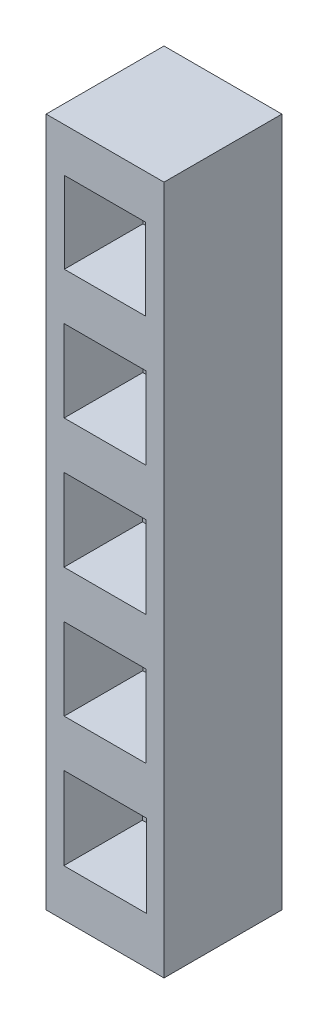
ISO-10303-21;
HEADER;
FILE_DESCRIPTION(('STEP AP214'),'2;1');
FILE_NAME('part.step','',(''),(''),'','','');
FILE_SCHEMA(('AUTOMOTIVE_DESIGN { 1 0 10303 214 1 1 1 1 }'));
ENDSEC;
DATA;
#1=APPLICATION_CONTEXT('core data for automotive mechanical design processes');
#2=APPLICATION_PROTOCOL_DEFINITION('international standard','automotive_design',2000,#1);
#3=PRODUCT_CONTEXT('',#1,'mechanical');
#4=PRODUCT('Part','Part','',(#3));
#5=PRODUCT_RELATED_PRODUCT_CATEGORY('part','',(#4));
#6=PRODUCT_DEFINITION_FORMATION('','',#4);
#7=PRODUCT_DEFINITION_CONTEXT('part definition',#1,'design');
#8=PRODUCT_DEFINITION('design','',#6,#7);
#9=PRODUCT_DEFINITION_SHAPE('','',#8);
#10=(LENGTH_UNIT() NAMED_UNIT(*) SI_UNIT(.MILLI.,.METRE.));
#11=(NAMED_UNIT(*) PLANE_ANGLE_UNIT() SI_UNIT($,.RADIAN.));
#12=(NAMED_UNIT(*) SI_UNIT($,.STERADIAN.) SOLID_ANGLE_UNIT());
#13=UNCERTAINTY_MEASURE_WITH_UNIT(LENGTH_MEASURE(1.E-05),#10,'distance_accuracy_value','');
#14=(GEOMETRIC_REPRESENTATION_CONTEXT(3) GLOBAL_UNCERTAINTY_ASSIGNED_CONTEXT((#13)) GLOBAL_UNIT_ASSIGNED_CONTEXT((#10,
#11,#12)) REPRESENTATION_CONTEXT('',''));
#15=CARTESIAN_POINT('',(0.,0.,0.));
#16=DIRECTION('',(0.,0.,1.));
#17=DIRECTION('',(1.,0.,0.));
#18=AXIS2_PLACEMENT_3D('',#15,#16,#17);
#19=CARTESIAN_POINT('',(7.5,-50.,15.));
#20=DIRECTION('',(-1.,0.,0.));
#21=DIRECTION('',(0.,0.,1.));
#22=AXIS2_PLACEMENT_3D('',#19,#20,#21);
#23=PLANE('',#22);
#24=DIRECTION('',(0.,1.,0.));
#25=VECTOR('',#24,1.);
#26=CARTESIAN_POINT('',(7.5,-50.,0.));
#27=LINE('',#26,#25);
#28=CARTESIAN_POINT('',(7.5,-50.,0.));
#29=VERTEX_POINT('',#28);
#30=CARTESIAN_POINT('',(7.5,37.6831724966616,0.));
#31=VERTEX_POINT('',#30);
#32=EDGE_CURVE('E220',#29,#31,#27,.T.);
#33=ORIENTED_EDGE('',*,*,#32,.T.);
#34=DIRECTION('',(0.,0.,1.));
#35=VECTOR('',#34,1.);
#36=CARTESIAN_POINT('',(7.5,37.6831724966616,0.));
#37=LINE('',#36,#35);
#38=CARTESIAN_POINT('',(7.5,37.6831724966616,15.));
#39=VERTEX_POINT('',#38);
#40=EDGE_CURVE('E53',#31,#39,#37,.T.);
#41=ORIENTED_EDGE('',*,*,#40,.T.);
#42=DIRECTION('',(0.,1.,0.));
#43=VECTOR('',#42,1.);
#44=CARTESIAN_POINT('',(7.5,-50.,15.));
#45=LINE('',#44,#43);
#46=CARTESIAN_POINT('',(7.5,-50.,15.));
#47=VERTEX_POINT('',#46);
#48=EDGE_CURVE('E224',#47,#39,#45,.T.);
#49=ORIENTED_EDGE('',*,*,#48,.F.);
#50=DIRECTION('',(0.,0.,-1.));
#51=VECTOR('',#50,1.);
#52=CARTESIAN_POINT('',(7.5,-50.,15.));
#53=LINE('',#52,#51);
#54=EDGE_CURVE('E46',#47,#29,#53,.T.);
#55=ORIENTED_EDGE('',*,*,#54,.T.);
#56=EDGE_LOOP('',(#33,#41,#49,#55));
#57=FACE_BOUND('',#56,.T.);
#58=ADVANCED_FACE('F38',(#57),#23,.F.);
#59=CARTESIAN_POINT('',(-7.5,-50.,15.));
#60=DIRECTION('',(1.,0.,0.));
#61=DIRECTION('',(0.,0.,-1.));
#62=AXIS2_PLACEMENT_3D('',#59,#60,#61);
#63=PLANE('',#62);
#64=DIRECTION('',(0.,-1.,0.));
#65=VECTOR('',#64,1.);
#66=CARTESIAN_POINT('',(-7.5,-50.,15.));
#67=LINE('',#66,#65);
#68=CARTESIAN_POINT('',(-7.5,37.6831724966616,15.));
#69=VERTEX_POINT('',#68);
#70=CARTESIAN_POINT('',(-7.5,-50.,15.));
#71=VERTEX_POINT('',#70);
#72=EDGE_CURVE('E213',#69,#71,#67,.T.);
#73=ORIENTED_EDGE('',*,*,#72,.F.);
#74=DIRECTION('',(0.,0.,1.));
#75=VECTOR('',#74,1.);
#76=CARTESIAN_POINT('',(-7.5,37.6831724966616,0.));
#77=LINE('',#76,#75);
#78=CARTESIAN_POINT('',(-7.5,37.6831724966616,0.));
#79=VERTEX_POINT('',#78);
#80=EDGE_CURVE('E199',#79,#69,#77,.T.);
#81=ORIENTED_EDGE('',*,*,#80,.F.);
#82=DIRECTION('',(0.,-1.,0.));
#83=VECTOR('',#82,1.);
#84=CARTESIAN_POINT('',(-7.5,-50.,0.));
#85=LINE('',#84,#83);
#86=CARTESIAN_POINT('',(-7.5,-50.,0.));
#87=VERTEX_POINT('',#86);
#88=EDGE_CURVE('E212',#79,#87,#85,.T.);
#89=ORIENTED_EDGE('',*,*,#88,.T.);
#90=DIRECTION('',(0.,0.,-1.));
#91=VECTOR('',#90,1.);
#92=CARTESIAN_POINT('',(-7.5,-50.,15.));
#93=LINE('',#92,#91);
#94=EDGE_CURVE('E11',#71,#87,#93,.T.);
#95=ORIENTED_EDGE('',*,*,#94,.F.);
#96=EDGE_LOOP('',(#73,#81,#89,#95));
#97=FACE_BOUND('',#96,.T.);
#98=ADVANCED_FACE('F210',(#97),#63,.F.);
#99=CARTESIAN_POINT('',(-7.5,-50.,15.));
#100=DIRECTION('',(0.,1.,0.));
#101=DIRECTION('',(0.,0.,1.));
#102=AXIS2_PLACEMENT_3D('',#99,#100,#101);
#103=PLANE('',#102);
#104=DIRECTION('',(1.,0.,0.));
#105=VECTOR('',#104,1.);
#106=CARTESIAN_POINT('',(-7.5,-50.,0.));
#107=LINE('',#106,#105);
#108=EDGE_CURVE('E218',#87,#29,#107,.T.);
#109=ORIENTED_EDGE('',*,*,#108,.T.);
#110=ORIENTED_EDGE('',*,*,#54,.F.);
#111=DIRECTION('',(1.,0.,0.));
#112=VECTOR('',#111,1.);
#113=CARTESIAN_POINT('',(-7.5,-50.,15.));
#114=LINE('',#113,#112);
#115=EDGE_CURVE('E231',#71,#47,#114,.T.);
#116=ORIENTED_EDGE('',*,*,#115,.F.);
#117=ORIENTED_EDGE('',*,*,#94,.T.);
#118=EDGE_LOOP('',(#109,#110,#116,#117));
#119=FACE_BOUND('',#118,.T.);
#120=ADVANCED_FACE('F466',(#119),#103,.F.);
#121=CARTESIAN_POINT('',(0.,0.,15.));
#122=DIRECTION('',(0.,0.,-1.));
#123=DIRECTION('',(-1.,0.,0.));
#124=AXIS2_PLACEMENT_3D('',#121,#122,#123);
#125=PLANE('',#124);
#126=DIRECTION('',(-1.,0.,0.));
#127=VECTOR('',#126,1.);
#128=CARTESIAN_POINT('',(-5.175,32.1,15.));
#129=LINE('',#128,#127);
#130=CARTESIAN_POINT('',(5.175,32.1,15.));
#131=VERTEX_POINT('',#130);
#132=CARTESIAN_POINT('',(-5.175,32.1,15.));
#133=VERTEX_POINT('',#132);
#134=EDGE_CURVE('E441',#131,#133,#129,.T.);
#135=ORIENTED_EDGE('',*,*,#134,.F.);
#136=DIRECTION('',(0.,1.,0.));
#137=VECTOR('',#136,1.);
#138=CARTESIAN_POINT('',(5.175,32.1,15.));
#139=LINE('',#138,#137);
#140=CARTESIAN_POINT('',(5.175,21.75,15.));
#141=VERTEX_POINT('',#140);
#142=EDGE_CURVE('E61',#141,#131,#139,.T.);
#143=ORIENTED_EDGE('',*,*,#142,.F.);
#144=DIRECTION('',(1.,0.,0.));
#145=VECTOR('',#144,1.);
#146=CARTESIAN_POINT('',(-5.175,21.75,15.));
#147=LINE('',#146,#145);
#148=CARTESIAN_POINT('',(-5.175,21.75,15.));
#149=VERTEX_POINT('',#148);
#150=EDGE_CURVE('E432',#149,#141,#147,.T.);
#151=ORIENTED_EDGE('',*,*,#150,.F.);
#152=DIRECTION('',(0.,-1.,0.));
#153=VECTOR('',#152,1.);
#154=CARTESIAN_POINT('',(-5.175,32.1,15.));
#155=LINE('',#154,#153);
#156=EDGE_CURVE('E437',#133,#149,#155,.T.);
#157=ORIENTED_EDGE('',*,*,#156,.F.);
#158=EDGE_LOOP('',(#135,#143,#151,#157));
#159=FACE_BOUND('',#158,.T.);
#160=DIRECTION('',(-1.,0.,0.));
#161=VECTOR('',#160,1.);
#162=CARTESIAN_POINT('',(-5.2,15.75,15.));
#163=LINE('',#162,#161);
#164=CARTESIAN_POINT('',(5.2,15.75,15.));
#165=VERTEX_POINT('',#164);
#166=CARTESIAN_POINT('',(-5.2,15.75,15.));
#167=VERTEX_POINT('',#166);
#168=EDGE_CURVE('E400',#165,#167,#163,.T.);
#169=ORIENTED_EDGE('',*,*,#168,.F.);
#170=DIRECTION('',(0.,1.,0.));
#171=VECTOR('',#170,1.);
#172=CARTESIAN_POINT('',(5.2,15.75,15.));
#173=LINE('',#172,#171);
#174=CARTESIAN_POINT('',(5.2,5.34999999999999,15.));
#175=VERTEX_POINT('',#174);
#176=EDGE_CURVE('E347',#175,#165,#173,.T.);
#177=ORIENTED_EDGE('',*,*,#176,.F.);
#178=DIRECTION('',(1.,0.,0.));
#179=VECTOR('',#178,1.);
#180=CARTESIAN_POINT('',(-5.2,5.34999999999999,15.));
#181=LINE('',#180,#179);
#182=CARTESIAN_POINT('',(-5.2,5.34999999999999,15.));
#183=VERTEX_POINT('',#182);
#184=EDGE_CURVE('E391',#183,#175,#181,.T.);
#185=ORIENTED_EDGE('',*,*,#184,.F.);
#186=DIRECTION('',(0.,-1.,0.));
#187=VECTOR('',#186,1.);
#188=CARTESIAN_POINT('',(-5.2,15.75,15.));
#189=LINE('',#188,#187);
#190=EDGE_CURVE('E396',#167,#183,#189,.T.);
#191=ORIENTED_EDGE('',*,*,#190,.F.);
#192=EDGE_LOOP('',(#169,#177,#185,#191));
#193=FACE_BOUND('',#192,.T.);
#194=DIRECTION('',(-1.,0.,0.));
#195=VECTOR('',#194,1.);
#196=CARTESIAN_POINT('',(-5.225,-0.650000000000012,15.));
#197=LINE('',#196,#195);
#198=CARTESIAN_POINT('',(5.225,-0.650000000000012,15.));
#199=VERTEX_POINT('',#198);
#200=CARTESIAN_POINT('',(-5.225,-0.650000000000012,15.));
#201=VERTEX_POINT('',#200);
#202=EDGE_CURVE('E357',#199,#201,#197,.T.);
#203=ORIENTED_EDGE('',*,*,#202,.F.);
#204=DIRECTION('',(0.,1.,0.));
#205=VECTOR('',#204,1.);
#206=CARTESIAN_POINT('',(5.225,-0.650000000000012,15.));
#207=LINE('',#206,#205);
#208=CARTESIAN_POINT('',(5.225,-11.1,15.));
#209=VERTEX_POINT('',#208);
#210=EDGE_CURVE('E303',#209,#199,#207,.T.);
#211=ORIENTED_EDGE('',*,*,#210,.F.);
#212=DIRECTION('',(1.,0.,0.));
#213=VECTOR('',#212,1.);
#214=CARTESIAN_POINT('',(-5.225,-11.1,15.));
#215=LINE('',#214,#213);
#216=CARTESIAN_POINT('',(-5.225,-11.1,15.));
#217=VERTEX_POINT('',#216);
#218=EDGE_CURVE('E348',#217,#209,#215,.T.);
#219=ORIENTED_EDGE('',*,*,#218,.F.);
#220=DIRECTION('',(0.,-1.,0.));
#221=VECTOR('',#220,1.);
#222=CARTESIAN_POINT('',(-5.225,-0.650000000000012,15.));
#223=LINE('',#222,#221);
#224=EDGE_CURVE('E353',#201,#217,#223,.T.);
#225=ORIENTED_EDGE('',*,*,#224,.F.);
#226=EDGE_LOOP('',(#203,#211,#219,#225));
#227=FACE_BOUND('',#226,.T.);
#228=DIRECTION('',(-1.,0.,0.));
#229=VECTOR('',#228,1.);
#230=CARTESIAN_POINT('',(-5.2,-17.1,15.));
#231=LINE('',#230,#229);
#232=CARTESIAN_POINT('',(5.2,-17.1,15.));
#233=VERTEX_POINT('',#232);
#234=CARTESIAN_POINT('',(-5.2,-17.1,15.));
#235=VERTEX_POINT('',#234);
#236=EDGE_CURVE('E313',#233,#235,#231,.T.);
#237=ORIENTED_EDGE('',*,*,#236,.F.);
#238=DIRECTION('',(0.,1.,0.));
#239=VECTOR('',#238,1.);
#240=CARTESIAN_POINT('',(5.2,-17.1,15.));
#241=LINE('',#240,#239);
#242=CARTESIAN_POINT('',(5.2,-27.5,15.));
#243=VERTEX_POINT('',#242);
#244=EDGE_CURVE('E258',#243,#233,#241,.T.);
#245=ORIENTED_EDGE('',*,*,#244,.F.);
#246=DIRECTION('',(1.,0.,0.));
#247=VECTOR('',#246,1.);
#248=CARTESIAN_POINT('',(-5.2,-27.5,15.));
#249=LINE('',#248,#247);
#250=CARTESIAN_POINT('',(-5.2,-27.5,15.));
#251=VERTEX_POINT('',#250);
#252=EDGE_CURVE('E304',#251,#243,#249,.T.);
#253=ORIENTED_EDGE('',*,*,#252,.F.);
#254=DIRECTION('',(0.,-1.,0.));
#255=VECTOR('',#254,1.);
#256=CARTESIAN_POINT('',(-5.2,-17.1,15.));
#257=LINE('',#256,#255);
#258=EDGE_CURVE('E309',#235,#251,#257,.T.);
#259=ORIENTED_EDGE('',*,*,#258,.F.);
#260=EDGE_LOOP('',(#237,#245,#253,#259));
#261=FACE_BOUND('',#260,.T.);
#262=DIRECTION('',(-1.,0.,0.));
#263=VECTOR('',#262,1.);
#264=CARTESIAN_POINT('',(-5.25,-33.5,15.));
#265=LINE('',#264,#263);
#266=CARTESIAN_POINT('',(5.25,-33.5,15.));
#267=VERTEX_POINT('',#266);
#268=CARTESIAN_POINT('',(-5.25,-33.5,15.));
#269=VERTEX_POINT('',#268);
#270=EDGE_CURVE('E268',#267,#269,#265,.T.);
#271=ORIENTED_EDGE('',*,*,#270,.F.);
#272=DIRECTION('',(0.,1.,0.));
#273=VECTOR('',#272,1.);
#274=CARTESIAN_POINT('',(5.25,-33.5,15.));
#275=LINE('',#274,#273);
#276=CARTESIAN_POINT('',(5.25,-44.,15.));
#277=VERTEX_POINT('',#276);
#278=EDGE_CURVE('E272',#277,#267,#275,.T.);
#279=ORIENTED_EDGE('',*,*,#278,.F.);
#280=DIRECTION('',(1.,0.,0.));
#281=VECTOR('',#280,1.);
#282=CARTESIAN_POINT('',(-5.25,-44.,15.));
#283=LINE('',#282,#281);
#284=CARTESIAN_POINT('',(-5.25,-44.,15.));
#285=VERTEX_POINT('',#284);
#286=EDGE_CURVE('E259',#285,#277,#283,.T.);
#287=ORIENTED_EDGE('',*,*,#286,.F.);
#288=DIRECTION('',(0.,-1.,0.));
#289=VECTOR('',#288,1.);
#290=CARTESIAN_POINT('',(-5.25,-33.5,15.));
#291=LINE('',#290,#289);
#292=EDGE_CURVE('E264',#269,#285,#291,.T.);
#293=ORIENTED_EDGE('',*,*,#292,.F.);
#294=EDGE_LOOP('',(#271,#279,#287,#293));
#295=FACE_BOUND('',#294,.T.);
#296=ORIENTED_EDGE('',*,*,#48,.T.);
#297=DIRECTION('',(1.,0.,0.));
#298=VECTOR('',#297,1.);
#299=CARTESIAN_POINT('',(-7.5,37.6831724966616,15.));
#300=LINE('',#299,#298);
#301=EDGE_CURVE('E206',#69,#39,#300,.T.);
#302=ORIENTED_EDGE('',*,*,#301,.F.);
#303=ORIENTED_EDGE('',*,*,#72,.T.);
#304=ORIENTED_EDGE('',*,*,#115,.T.);
#305=EDGE_LOOP('',(#296,#302,#303,#304));
#306=FACE_BOUND('',#305,.T.);
#307=ADVANCED_FACE('F464',(#159,#193,#227,#261,#295,#306),#125,.F.);
#308=CARTESIAN_POINT('',(0.,0.,0.));
#309=DIRECTION('',(0.,0.,-1.));
#310=DIRECTION('',(-1.,0.,0.));
#311=AXIS2_PLACEMENT_3D('',#308,#309,#310);
#312=PLANE('',#311);
#313=DIRECTION('',(1.,0.,0.));
#314=VECTOR('',#313,1.);
#315=CARTESIAN_POINT('',(-7.5,37.6831724966616,0.));
#316=LINE('',#315,#314);
#317=EDGE_CURVE('E196',#79,#31,#316,.T.);
#318=ORIENTED_EDGE('',*,*,#317,.T.);
#319=ORIENTED_EDGE('',*,*,#32,.F.);
#320=ORIENTED_EDGE('',*,*,#108,.F.);
#321=ORIENTED_EDGE('',*,*,#88,.F.);
#322=EDGE_LOOP('',(#318,#319,#320,#321));
#323=FACE_BOUND('',#322,.T.);
#324=ADVANCED_FACE('F217',(#323),#312,.T.);
#325=CARTESIAN_POINT('',(5.25,-33.5,5.));
#326=DIRECTION('',(1.,0.,0.));
#327=DIRECTION('',(0.,1.,0.));
#328=AXIS2_PLACEMENT_3D('',#325,#326,#327);
#329=PLANE('',#328);
#330=ORIENTED_EDGE('',*,*,#278,.T.);
#331=DIRECTION('',(0.,0.,1.));
#332=VECTOR('',#331,1.);
#333=CARTESIAN_POINT('',(5.25,-33.5,5.));
#334=LINE('',#333,#332);
#335=CARTESIAN_POINT('',(5.25,-33.5,5.));
#336=VERTEX_POINT('',#335);
#337=EDGE_CURVE('E244',#336,#267,#334,.T.);
#338=ORIENTED_EDGE('',*,*,#337,.F.);
#339=DIRECTION('',(0.,1.,0.));
#340=VECTOR('',#339,1.);
#341=CARTESIAN_POINT('',(5.25,-33.5,5.));
#342=LINE('',#341,#340);
#343=CARTESIAN_POINT('',(5.25,-44.,5.));
#344=VERTEX_POINT('',#343);
#345=EDGE_CURVE('E263',#344,#336,#342,.T.);
#346=ORIENTED_EDGE('',*,*,#345,.F.);
#347=DIRECTION('',(0.,0.,1.));
#348=VECTOR('',#347,1.);
#349=CARTESIAN_POINT('',(5.25,-44.,5.));
#350=LINE('',#349,#348);
#351=EDGE_CURVE('E255',#344,#277,#350,.T.);
#352=ORIENTED_EDGE('',*,*,#351,.T.);
#353=EDGE_LOOP('',(#330,#338,#346,#352));
#354=FACE_BOUND('',#353,.T.);
#355=ADVANCED_FACE('F473',(#354),#329,.F.);
#356=CARTESIAN_POINT('',(-5.25,-44.,5.));
#357=DIRECTION('',(0.,-1.,0.));
#358=DIRECTION('',(1.,0.,0.));
#359=AXIS2_PLACEMENT_3D('',#356,#357,#358);
#360=PLANE('',#359);
#361=ORIENTED_EDGE('',*,*,#286,.T.);
#362=ORIENTED_EDGE('',*,*,#351,.F.);
#363=DIRECTION('',(1.,0.,0.));
#364=VECTOR('',#363,1.);
#365=CARTESIAN_POINT('',(-5.25,-44.,5.));
#366=LINE('',#365,#364);
#367=CARTESIAN_POINT('',(-5.25,-44.,5.));
#368=VERTEX_POINT('',#367);
#369=EDGE_CURVE('E249',#368,#344,#366,.T.);
#370=ORIENTED_EDGE('',*,*,#369,.F.);
#371=DIRECTION('',(0.,0.,1.));
#372=VECTOR('',#371,1.);
#373=CARTESIAN_POINT('',(-5.25,-44.,5.));
#374=LINE('',#373,#372);
#375=EDGE_CURVE('E252',#368,#285,#374,.T.);
#376=ORIENTED_EDGE('',*,*,#375,.T.);
#377=EDGE_LOOP('',(#361,#362,#370,#376));
#378=FACE_BOUND('',#377,.T.);
#379=ADVANCED_FACE('F513',(#378),#360,.F.);
#380=CARTESIAN_POINT('',(-5.25,-33.5,5.));
#381=DIRECTION('',(-1.,0.,0.));
#382=DIRECTION('',(0.,-1.,0.));
#383=AXIS2_PLACEMENT_3D('',#380,#381,#382);
#384=PLANE('',#383);
#385=ORIENTED_EDGE('',*,*,#292,.T.);
#386=ORIENTED_EDGE('',*,*,#375,.F.);
#387=DIRECTION('',(0.,-1.,0.));
#388=VECTOR('',#387,1.);
#389=CARTESIAN_POINT('',(-5.25,-33.5,5.));
#390=LINE('',#389,#388);
#391=CARTESIAN_POINT('',(-5.25,-33.5,5.));
#392=VERTEX_POINT('',#391);
#393=EDGE_CURVE('E278',#392,#368,#390,.T.);
#394=ORIENTED_EDGE('',*,*,#393,.F.);
#395=DIRECTION('',(0.,0.,1.));
#396=VECTOR('',#395,1.);
#397=CARTESIAN_POINT('',(-5.25,-33.5,5.));
#398=LINE('',#397,#396);
#399=EDGE_CURVE('E248',#392,#269,#398,.T.);
#400=ORIENTED_EDGE('',*,*,#399,.T.);
#401=EDGE_LOOP('',(#385,#386,#394,#400));
#402=FACE_BOUND('',#401,.T.);
#403=ADVANCED_FACE('F519',(#402),#384,.F.);
#404=CARTESIAN_POINT('',(-5.25,-33.5,5.));
#405=DIRECTION('',(0.,1.,0.));
#406=DIRECTION('',(0.,0.,1.));
#407=AXIS2_PLACEMENT_3D('',#404,#405,#406);
#408=PLANE('',#407);
#409=ORIENTED_EDGE('',*,*,#270,.T.);
#410=ORIENTED_EDGE('',*,*,#399,.F.);
#411=DIRECTION('',(-1.,0.,0.));
#412=VECTOR('',#411,1.);
#413=CARTESIAN_POINT('',(-5.25,-33.5,5.));
#414=LINE('',#413,#412);
#415=EDGE_CURVE('E282',#336,#392,#414,.T.);
#416=ORIENTED_EDGE('',*,*,#415,.F.);
#417=ORIENTED_EDGE('',*,*,#337,.T.);
#418=EDGE_LOOP('',(#409,#410,#416,#417));
#419=FACE_BOUND('',#418,.T.);
#420=ADVANCED_FACE('F527',(#419),#408,.F.);
#421=CARTESIAN_POINT('',(0.,0.,5.));
#422=DIRECTION('',(0.,0.,1.));
#423=DIRECTION('',(1.,0.,0.));
#424=AXIS2_PLACEMENT_3D('',#421,#422,#423);
#425=PLANE('',#424);
#426=ORIENTED_EDGE('',*,*,#345,.T.);
#427=ORIENTED_EDGE('',*,*,#415,.T.);
#428=ORIENTED_EDGE('',*,*,#393,.T.);
#429=ORIENTED_EDGE('',*,*,#369,.T.);
#430=EDGE_LOOP('',(#426,#427,#428,#429));
#431=FACE_BOUND('',#430,.T.);
#432=ADVANCED_FACE('F535',(#431),#425,.T.);
#433=CARTESIAN_POINT('',(5.2,-17.1,5.));
#434=DIRECTION('',(1.,0.,0.));
#435=DIRECTION('',(0.,1.,0.));
#436=AXIS2_PLACEMENT_3D('',#433,#434,#435);
#437=PLANE('',#436);
#438=ORIENTED_EDGE('',*,*,#244,.T.);
#439=DIRECTION('',(0.,0.,1.));
#440=VECTOR('',#439,1.);
#441=CARTESIAN_POINT('',(5.2,-17.1,5.));
#442=LINE('',#441,#440);
#443=CARTESIAN_POINT('',(5.2,-17.1,5.));
#444=VERTEX_POINT('',#443);
#445=EDGE_CURVE('E289',#444,#233,#442,.T.);
#446=ORIENTED_EDGE('',*,*,#445,.F.);
#447=DIRECTION('',(0.,1.,0.));
#448=VECTOR('',#447,1.);
#449=CARTESIAN_POINT('',(5.2,-17.1,5.));
#450=LINE('',#449,#448);
#451=CARTESIAN_POINT('',(5.2,-27.5,5.));
#452=VERTEX_POINT('',#451);
#453=EDGE_CURVE('E308',#452,#444,#450,.T.);
#454=ORIENTED_EDGE('',*,*,#453,.F.);
#455=DIRECTION('',(0.,0.,1.));
#456=VECTOR('',#455,1.);
#457=CARTESIAN_POINT('',(5.2,-27.5,5.));
#458=LINE('',#457,#456);
#459=EDGE_CURVE('E300',#452,#243,#458,.T.);
#460=ORIENTED_EDGE('',*,*,#459,.T.);
#461=EDGE_LOOP('',(#438,#446,#454,#460));
#462=FACE_BOUND('',#461,.T.);
#463=ADVANCED_FACE('F543',(#462),#437,.F.);
#464=CARTESIAN_POINT('',(-5.2,-27.5,5.));
#465=DIRECTION('',(0.,-1.,0.));
#466=DIRECTION('',(1.,0.,0.));
#467=AXIS2_PLACEMENT_3D('',#464,#465,#466);
#468=PLANE('',#467);
#469=ORIENTED_EDGE('',*,*,#252,.T.);
#470=ORIENTED_EDGE('',*,*,#459,.F.);
#471=DIRECTION('',(1.,0.,0.));
#472=VECTOR('',#471,1.);
#473=CARTESIAN_POINT('',(-5.2,-27.5,5.));
#474=LINE('',#473,#472);
#475=CARTESIAN_POINT('',(-5.2,-27.5,5.));
#476=VERTEX_POINT('',#475);
#477=EDGE_CURVE('E294',#476,#452,#474,.T.);
#478=ORIENTED_EDGE('',*,*,#477,.F.);
#479=DIRECTION('',(0.,0.,1.));
#480=VECTOR('',#479,1.);
#481=CARTESIAN_POINT('',(-5.2,-27.5,5.));
#482=LINE('',#481,#480);
#483=EDGE_CURVE('E297',#476,#251,#482,.T.);
#484=ORIENTED_EDGE('',*,*,#483,.T.);
#485=EDGE_LOOP('',(#469,#470,#478,#484));
#486=FACE_BOUND('',#485,.T.);
#487=ADVANCED_FACE('F551',(#486),#468,.F.);
#488=CARTESIAN_POINT('',(-5.2,-17.1,5.));
#489=DIRECTION('',(-1.,0.,0.));
#490=DIRECTION('',(0.,-1.,0.));
#491=AXIS2_PLACEMENT_3D('',#488,#489,#490);
#492=PLANE('',#491);
#493=ORIENTED_EDGE('',*,*,#258,.T.);
#494=ORIENTED_EDGE('',*,*,#483,.F.);
#495=DIRECTION('',(0.,-1.,0.));
#496=VECTOR('',#495,1.);
#497=CARTESIAN_POINT('',(-5.2,-17.1,5.));
#498=LINE('',#497,#496);
#499=CARTESIAN_POINT('',(-5.2,-17.1,5.));
#500=VERTEX_POINT('',#499);
#501=EDGE_CURVE('E322',#500,#476,#498,.T.);
#502=ORIENTED_EDGE('',*,*,#501,.F.);
#503=DIRECTION('',(0.,0.,1.));
#504=VECTOR('',#503,1.);
#505=CARTESIAN_POINT('',(-5.2,-17.1,5.));
#506=LINE('',#505,#504);
#507=EDGE_CURVE('E293',#500,#235,#506,.T.);
#508=ORIENTED_EDGE('',*,*,#507,.T.);
#509=EDGE_LOOP('',(#493,#494,#502,#508));
#510=FACE_BOUND('',#509,.T.);
#511=ADVANCED_FACE('F559',(#510),#492,.F.);
#512=CARTESIAN_POINT('',(-5.2,-17.1,5.));
#513=DIRECTION('',(0.,1.,0.));
#514=DIRECTION('',(0.,0.,1.));
#515=AXIS2_PLACEMENT_3D('',#512,#513,#514);
#516=PLANE('',#515);
#517=ORIENTED_EDGE('',*,*,#236,.T.);
#518=ORIENTED_EDGE('',*,*,#507,.F.);
#519=DIRECTION('',(-1.,0.,0.));
#520=VECTOR('',#519,1.);
#521=CARTESIAN_POINT('',(-5.2,-17.1,5.));
#522=LINE('',#521,#520);
#523=EDGE_CURVE('E326',#444,#500,#522,.T.);
#524=ORIENTED_EDGE('',*,*,#523,.F.);
#525=ORIENTED_EDGE('',*,*,#445,.T.);
#526=EDGE_LOOP('',(#517,#518,#524,#525));
#527=FACE_BOUND('',#526,.T.);
#528=ADVANCED_FACE('F567',(#527),#516,.F.);
#529=CARTESIAN_POINT('',(0.,0.,5.));
#530=DIRECTION('',(0.,0.,1.));
#531=DIRECTION('',(1.,0.,0.));
#532=AXIS2_PLACEMENT_3D('',#529,#530,#531);
#533=PLANE('',#532);
#534=ORIENTED_EDGE('',*,*,#453,.T.);
#535=ORIENTED_EDGE('',*,*,#523,.T.);
#536=ORIENTED_EDGE('',*,*,#501,.T.);
#537=ORIENTED_EDGE('',*,*,#477,.T.);
#538=EDGE_LOOP('',(#534,#535,#536,#537));
#539=FACE_BOUND('',#538,.T.);
#540=ADVANCED_FACE('F575',(#539),#533,.T.);
#541=CARTESIAN_POINT('',(5.225,-0.650000000000012,5.));
#542=DIRECTION('',(1.,0.,0.));
#543=DIRECTION('',(0.,1.,0.));
#544=AXIS2_PLACEMENT_3D('',#541,#542,#543);
#545=PLANE('',#544);
#546=ORIENTED_EDGE('',*,*,#210,.T.);
#547=DIRECTION('',(0.,0.,1.));
#548=VECTOR('',#547,1.);
#549=CARTESIAN_POINT('',(5.225,-0.650000000000012,5.));
#550=LINE('',#549,#548);
#551=CARTESIAN_POINT('',(5.225,-0.650000000000012,5.));
#552=VERTEX_POINT('',#551);
#553=EDGE_CURVE('E333',#552,#199,#550,.T.);
#554=ORIENTED_EDGE('',*,*,#553,.F.);
#555=DIRECTION('',(0.,1.,0.));
#556=VECTOR('',#555,1.);
#557=CARTESIAN_POINT('',(5.225,-0.650000000000012,5.));
#558=LINE('',#557,#556);
#559=CARTESIAN_POINT('',(5.225,-11.1,5.));
#560=VERTEX_POINT('',#559);
#561=EDGE_CURVE('E352',#560,#552,#558,.T.);
#562=ORIENTED_EDGE('',*,*,#561,.F.);
#563=DIRECTION('',(0.,0.,1.));
#564=VECTOR('',#563,1.);
#565=CARTESIAN_POINT('',(5.225,-11.1,5.));
#566=LINE('',#565,#564);
#567=EDGE_CURVE('E344',#560,#209,#566,.T.);
#568=ORIENTED_EDGE('',*,*,#567,.T.);
#569=EDGE_LOOP('',(#546,#554,#562,#568));
#570=FACE_BOUND('',#569,.T.);
#571=ADVANCED_FACE('F583',(#570),#545,.F.);
#572=CARTESIAN_POINT('',(-5.225,-11.1,5.));
#573=DIRECTION('',(0.,-1.,0.));
#574=DIRECTION('',(0.,0.,-1.));
#575=AXIS2_PLACEMENT_3D('',#572,#573,#574);
#576=PLANE('',#575);
#577=ORIENTED_EDGE('',*,*,#218,.T.);
#578=ORIENTED_EDGE('',*,*,#567,.F.);
#579=DIRECTION('',(1.,0.,0.));
#580=VECTOR('',#579,1.);
#581=CARTESIAN_POINT('',(-5.225,-11.1,5.));
#582=LINE('',#581,#580);
#583=CARTESIAN_POINT('',(-5.225,-11.1,5.));
#584=VERTEX_POINT('',#583);
#585=EDGE_CURVE('E338',#584,#560,#582,.T.);
#586=ORIENTED_EDGE('',*,*,#585,.F.);
#587=DIRECTION('',(0.,0.,1.));
#588=VECTOR('',#587,1.);
#589=CARTESIAN_POINT('',(-5.225,-11.1,5.));
#590=LINE('',#589,#588);
#591=EDGE_CURVE('E341',#584,#217,#590,.T.);
#592=ORIENTED_EDGE('',*,*,#591,.T.);
#593=EDGE_LOOP('',(#577,#578,#586,#592));
#594=FACE_BOUND('',#593,.T.);
#595=ADVANCED_FACE('F591',(#594),#576,.F.);
#596=CARTESIAN_POINT('',(-5.225,-0.650000000000012,5.));
#597=DIRECTION('',(-1.,0.,0.));
#598=DIRECTION('',(0.,-1.,0.));
#599=AXIS2_PLACEMENT_3D('',#596,#597,#598);
#600=PLANE('',#599);
#601=ORIENTED_EDGE('',*,*,#224,.T.);
#602=ORIENTED_EDGE('',*,*,#591,.F.);
#603=DIRECTION('',(0.,-1.,0.));
#604=VECTOR('',#603,1.);
#605=CARTESIAN_POINT('',(-5.225,-0.650000000000012,5.));
#606=LINE('',#605,#604);
#607=CARTESIAN_POINT('',(-5.225,-0.650000000000012,5.));
#608=VERTEX_POINT('',#607);
#609=EDGE_CURVE('E366',#608,#584,#606,.T.);
#610=ORIENTED_EDGE('',*,*,#609,.F.);
#611=DIRECTION('',(0.,0.,1.));
#612=VECTOR('',#611,1.);
#613=CARTESIAN_POINT('',(-5.225,-0.650000000000012,5.));
#614=LINE('',#613,#612);
#615=EDGE_CURVE('E337',#608,#201,#614,.T.);
#616=ORIENTED_EDGE('',*,*,#615,.T.);
#617=EDGE_LOOP('',(#601,#602,#610,#616));
#618=FACE_BOUND('',#617,.T.);
#619=ADVANCED_FACE('F599',(#618),#600,.F.);
#620=CARTESIAN_POINT('',(-5.225,-0.650000000000012,5.));
#621=DIRECTION('',(0.,1.,0.));
#622=DIRECTION('',(0.,0.,1.));
#623=AXIS2_PLACEMENT_3D('',#620,#621,#622);
#624=PLANE('',#623);
#625=ORIENTED_EDGE('',*,*,#202,.T.);
#626=ORIENTED_EDGE('',*,*,#615,.F.);
#627=DIRECTION('',(-1.,0.,0.));
#628=VECTOR('',#627,1.);
#629=CARTESIAN_POINT('',(-5.225,-0.650000000000012,5.));
#630=LINE('',#629,#628);
#631=EDGE_CURVE('E370',#552,#608,#630,.T.);
#632=ORIENTED_EDGE('',*,*,#631,.F.);
#633=ORIENTED_EDGE('',*,*,#553,.T.);
#634=EDGE_LOOP('',(#625,#626,#632,#633));
#635=FACE_BOUND('',#634,.T.);
#636=ADVANCED_FACE('F607',(#635),#624,.F.);
#637=CARTESIAN_POINT('',(0.,0.,5.));
#638=DIRECTION('',(0.,0.,1.));
#639=DIRECTION('',(1.,0.,0.));
#640=AXIS2_PLACEMENT_3D('',#637,#638,#639);
#641=PLANE('',#640);
#642=ORIENTED_EDGE('',*,*,#561,.T.);
#643=ORIENTED_EDGE('',*,*,#631,.T.);
#644=ORIENTED_EDGE('',*,*,#609,.T.);
#645=ORIENTED_EDGE('',*,*,#585,.T.);
#646=EDGE_LOOP('',(#642,#643,#644,#645));
#647=FACE_BOUND('',#646,.T.);
#648=ADVANCED_FACE('F615',(#647),#641,.T.);
#649=CARTESIAN_POINT('',(5.2,15.75,5.));
#650=DIRECTION('',(1.,0.,0.));
#651=DIRECTION('',(0.,1.,0.));
#652=AXIS2_PLACEMENT_3D('',#649,#650,#651);
#653=PLANE('',#652);
#654=ORIENTED_EDGE('',*,*,#176,.T.);
#655=DIRECTION('',(0.,0.,1.));
#656=VECTOR('',#655,1.);
#657=CARTESIAN_POINT('',(5.2,15.75,5.));
#658=LINE('',#657,#656);
#659=CARTESIAN_POINT('',(5.2,15.75,5.));
#660=VERTEX_POINT('',#659);
#661=EDGE_CURVE('E377',#660,#165,#658,.T.);
#662=ORIENTED_EDGE('',*,*,#661,.F.);
#663=DIRECTION('',(0.,1.,0.));
#664=VECTOR('',#663,1.);
#665=CARTESIAN_POINT('',(5.2,15.75,5.));
#666=LINE('',#665,#664);
#667=CARTESIAN_POINT('',(5.2,5.34999999999999,5.));
#668=VERTEX_POINT('',#667);
#669=EDGE_CURVE('E395',#668,#660,#666,.T.);
#670=ORIENTED_EDGE('',*,*,#669,.F.);
#671=DIRECTION('',(0.,0.,1.));
#672=VECTOR('',#671,1.);
#673=CARTESIAN_POINT('',(5.2,5.34999999999999,5.));
#674=LINE('',#673,#672);
#675=EDGE_CURVE('E388',#668,#175,#674,.T.);
#676=ORIENTED_EDGE('',*,*,#675,.T.);
#677=EDGE_LOOP('',(#654,#662,#670,#676));
#678=FACE_BOUND('',#677,.T.);
#679=ADVANCED_FACE('F623',(#678),#653,.F.);
#680=CARTESIAN_POINT('',(-5.2,5.34999999999999,5.));
#681=DIRECTION('',(0.,-1.,0.));
#682=DIRECTION('',(0.,0.,-1.));
#683=AXIS2_PLACEMENT_3D('',#680,#681,#682);
#684=PLANE('',#683);
#685=ORIENTED_EDGE('',*,*,#184,.T.);
#686=ORIENTED_EDGE('',*,*,#675,.F.);
#687=DIRECTION('',(1.,0.,0.));
#688=VECTOR('',#687,1.);
#689=CARTESIAN_POINT('',(-5.2,5.34999999999999,5.));
#690=LINE('',#689,#688);
#691=CARTESIAN_POINT('',(-5.2,5.34999999999999,5.));
#692=VERTEX_POINT('',#691);
#693=EDGE_CURVE('E382',#692,#668,#690,.T.);
#694=ORIENTED_EDGE('',*,*,#693,.F.);
#695=DIRECTION('',(0.,0.,1.));
#696=VECTOR('',#695,1.);
#697=CARTESIAN_POINT('',(-5.2,5.34999999999999,5.));
#698=LINE('',#697,#696);
#699=EDGE_CURVE('E385',#692,#183,#698,.T.);
#700=ORIENTED_EDGE('',*,*,#699,.T.);
#701=EDGE_LOOP('',(#685,#686,#694,#700));
#702=FACE_BOUND('',#701,.T.);
#703=ADVANCED_FACE('F631',(#702),#684,.F.);
#704=CARTESIAN_POINT('',(-5.2,15.75,5.));
#705=DIRECTION('',(-1.,0.,0.));
#706=DIRECTION('',(0.,-1.,0.));
#707=AXIS2_PLACEMENT_3D('',#704,#705,#706);
#708=PLANE('',#707);
#709=ORIENTED_EDGE('',*,*,#190,.T.);
#710=ORIENTED_EDGE('',*,*,#699,.F.);
#711=DIRECTION('',(0.,-1.,0.));
#712=VECTOR('',#711,1.);
#713=CARTESIAN_POINT('',(-5.2,15.75,5.));
#714=LINE('',#713,#712);
#715=CARTESIAN_POINT('',(-5.2,15.75,5.));
#716=VERTEX_POINT('',#715);
#717=EDGE_CURVE('E409',#716,#692,#714,.T.);
#718=ORIENTED_EDGE('',*,*,#717,.F.);
#719=DIRECTION('',(0.,0.,1.));
#720=VECTOR('',#719,1.);
#721=CARTESIAN_POINT('',(-5.2,15.75,5.));
#722=LINE('',#721,#720);
#723=EDGE_CURVE('E381',#716,#167,#722,.T.);
#724=ORIENTED_EDGE('',*,*,#723,.T.);
#725=EDGE_LOOP('',(#709,#710,#718,#724));
#726=FACE_BOUND('',#725,.T.);
#727=ADVANCED_FACE('F639',(#726),#708,.F.);
#728=CARTESIAN_POINT('',(-5.2,15.75,5.));
#729=DIRECTION('',(0.,1.,0.));
#730=DIRECTION('',(0.,0.,1.));
#731=AXIS2_PLACEMENT_3D('',#728,#729,#730);
#732=PLANE('',#731);
#733=ORIENTED_EDGE('',*,*,#168,.T.);
#734=ORIENTED_EDGE('',*,*,#723,.F.);
#735=DIRECTION('',(-1.,0.,0.));
#736=VECTOR('',#735,1.);
#737=CARTESIAN_POINT('',(-5.2,15.75,5.));
#738=LINE('',#737,#736);
#739=EDGE_CURVE('E413',#660,#716,#738,.T.);
#740=ORIENTED_EDGE('',*,*,#739,.F.);
#741=ORIENTED_EDGE('',*,*,#661,.T.);
#742=EDGE_LOOP('',(#733,#734,#740,#741));
#743=FACE_BOUND('',#742,.T.);
#744=ADVANCED_FACE('F647',(#743),#732,.F.);
#745=CARTESIAN_POINT('',(0.,0.,5.));
#746=DIRECTION('',(0.,0.,1.));
#747=DIRECTION('',(1.,0.,0.));
#748=AXIS2_PLACEMENT_3D('',#745,#746,#747);
#749=PLANE('',#748);
#750=ORIENTED_EDGE('',*,*,#669,.T.);
#751=ORIENTED_EDGE('',*,*,#739,.T.);
#752=ORIENTED_EDGE('',*,*,#717,.T.);
#753=ORIENTED_EDGE('',*,*,#693,.T.);
#754=EDGE_LOOP('',(#750,#751,#752,#753));
#755=FACE_BOUND('',#754,.T.);
#756=ADVANCED_FACE('F655',(#755),#749,.T.);
#757=CARTESIAN_POINT('',(5.175,32.1,5.));
#758=DIRECTION('',(1.,0.,0.));
#759=DIRECTION('',(0.,1.,0.));
#760=AXIS2_PLACEMENT_3D('',#757,#758,#759);
#761=PLANE('',#760);
#762=ORIENTED_EDGE('',*,*,#142,.T.);
#763=DIRECTION('',(0.,0.,1.));
#764=VECTOR('',#763,1.);
#765=CARTESIAN_POINT('',(5.175,32.1,5.));
#766=LINE('',#765,#764);
#767=CARTESIAN_POINT('',(5.175,32.1,5.));
#768=VERTEX_POINT('',#767);
#769=EDGE_CURVE('E420',#768,#131,#766,.T.);
#770=ORIENTED_EDGE('',*,*,#769,.F.);
#771=DIRECTION('',(0.,1.,0.));
#772=VECTOR('',#771,1.);
#773=CARTESIAN_POINT('',(5.175,32.1,5.));
#774=LINE('',#773,#772);
#775=CARTESIAN_POINT('',(5.175,21.75,5.));
#776=VERTEX_POINT('',#775);
#777=EDGE_CURVE('E436',#776,#768,#774,.T.);
#778=ORIENTED_EDGE('',*,*,#777,.F.);
#779=DIRECTION('',(0.,0.,1.));
#780=VECTOR('',#779,1.);
#781=CARTESIAN_POINT('',(5.175,21.75,5.));
#782=LINE('',#781,#780);
#783=EDGE_CURVE('E226',#776,#141,#782,.T.);
#784=ORIENTED_EDGE('',*,*,#783,.T.);
#785=EDGE_LOOP('',(#762,#770,#778,#784));
#786=FACE_BOUND('',#785,.T.);
#787=ADVANCED_FACE('F663',(#786),#761,.F.);
#788=CARTESIAN_POINT('',(-5.175,21.75,5.));
#789=DIRECTION('',(0.,-1.,0.));
#790=DIRECTION('',(0.,0.,-1.));
#791=AXIS2_PLACEMENT_3D('',#788,#789,#790);
#792=PLANE('',#791);
#793=ORIENTED_EDGE('',*,*,#150,.T.);
#794=ORIENTED_EDGE('',*,*,#783,.F.);
#795=DIRECTION('',(1.,0.,0.));
#796=VECTOR('',#795,1.);
#797=CARTESIAN_POINT('',(-5.175,21.75,5.));
#798=LINE('',#797,#796);
#799=CARTESIAN_POINT('',(-5.175,21.75,5.));
#800=VERTEX_POINT('',#799);
#801=EDGE_CURVE('E424',#800,#776,#798,.T.);
#802=ORIENTED_EDGE('',*,*,#801,.F.);
#803=DIRECTION('',(0.,0.,1.));
#804=VECTOR('',#803,1.);
#805=CARTESIAN_POINT('',(-5.175,21.75,5.));
#806=LINE('',#805,#804);
#807=EDGE_CURVE('E427',#800,#149,#806,.T.);
#808=ORIENTED_EDGE('',*,*,#807,.T.);
#809=EDGE_LOOP('',(#793,#794,#802,#808));
#810=FACE_BOUND('',#809,.T.);
#811=ADVANCED_FACE('F671',(#810),#792,.F.);
#812=CARTESIAN_POINT('',(-5.175,32.1,5.));
#813=DIRECTION('',(-1.,0.,0.));
#814=DIRECTION('',(0.,-1.,0.));
#815=AXIS2_PLACEMENT_3D('',#812,#813,#814);
#816=PLANE('',#815);
#817=ORIENTED_EDGE('',*,*,#156,.T.);
#818=ORIENTED_EDGE('',*,*,#807,.F.);
#819=DIRECTION('',(0.,-1.,0.));
#820=VECTOR('',#819,1.);
#821=CARTESIAN_POINT('',(-5.175,32.1,5.));
#822=LINE('',#821,#820);
#823=CARTESIAN_POINT('',(-5.175,32.1,5.));
#824=VERTEX_POINT('',#823);
#825=EDGE_CURVE('E450',#824,#800,#822,.T.);
#826=ORIENTED_EDGE('',*,*,#825,.F.);
#827=DIRECTION('',(0.,0.,1.));
#828=VECTOR('',#827,1.);
#829=CARTESIAN_POINT('',(-5.175,32.1,5.));
#830=LINE('',#829,#828);
#831=EDGE_CURVE('E423',#824,#133,#830,.T.);
#832=ORIENTED_EDGE('',*,*,#831,.T.);
#833=EDGE_LOOP('',(#817,#818,#826,#832));
#834=FACE_BOUND('',#833,.T.);
#835=ADVANCED_FACE('F678',(#834),#816,.F.);
#836=CARTESIAN_POINT('',(-5.175,32.1,5.));
#837=DIRECTION('',(0.,1.,0.));
#838=DIRECTION('',(0.,0.,1.));
#839=AXIS2_PLACEMENT_3D('',#836,#837,#838);
#840=PLANE('',#839);
#841=ORIENTED_EDGE('',*,*,#134,.T.);
#842=ORIENTED_EDGE('',*,*,#831,.F.);
#843=DIRECTION('',(-1.,0.,0.));
#844=VECTOR('',#843,1.);
#845=CARTESIAN_POINT('',(-5.175,32.1,5.));
#846=LINE('',#845,#844);
#847=EDGE_CURVE('E454',#768,#824,#846,.T.);
#848=ORIENTED_EDGE('',*,*,#847,.F.);
#849=ORIENTED_EDGE('',*,*,#769,.T.);
#850=EDGE_LOOP('',(#841,#842,#848,#849));
#851=FACE_BOUND('',#850,.T.);
#852=ADVANCED_FACE('F686',(#851),#840,.F.);
#853=CARTESIAN_POINT('',(0.,0.,5.));
#854=DIRECTION('',(0.,0.,1.));
#855=DIRECTION('',(1.,0.,0.));
#856=AXIS2_PLACEMENT_3D('',#853,#854,#855);
#857=PLANE('',#856);
#858=ORIENTED_EDGE('',*,*,#777,.T.);
#859=ORIENTED_EDGE('',*,*,#847,.T.);
#860=ORIENTED_EDGE('',*,*,#825,.T.);
#861=ORIENTED_EDGE('',*,*,#801,.T.);
#862=EDGE_LOOP('',(#858,#859,#860,#861));
#863=FACE_BOUND('',#862,.T.);
#864=ADVANCED_FACE('F694',(#863),#857,.T.);
#865=CARTESIAN_POINT('',(-7.5,37.6831724966616,0.));
#866=DIRECTION('',(0.,-1.,0.));
#867=DIRECTION('',(0.,0.,-1.));
#868=AXIS2_PLACEMENT_3D('',#865,#866,#867);
#869=PLANE('',#868);
#870=ORIENTED_EDGE('',*,*,#301,.T.);
#871=ORIENTED_EDGE('',*,*,#40,.F.);
#872=ORIENTED_EDGE('',*,*,#317,.F.);
#873=ORIENTED_EDGE('',*,*,#80,.T.);
#874=EDGE_LOOP('',(#870,#871,#872,#873));
#875=FACE_BOUND('',#874,.T.);
#876=ADVANCED_FACE('F198',(#875),#869,.F.);
#877=CLOSED_SHELL('',(#58,#98,#120,#307,#324,#355,#379,#403,#420,#432,#463,#487,#511,#528,#540,
#571,#595,#619,#636,#648,#679,#703,#727,#744,#756,#787,#811,#835,#852,#864,#876));
#878=MANIFOLD_SOLID_BREP('B2',#877);
#879=ADVANCED_BREP_SHAPE_REPRESENTATION('',(#18,#878),#14);
#880=SHAPE_DEFINITION_REPRESENTATION(#9,#879);
ENDSEC;
END-ISO-10303-21;
